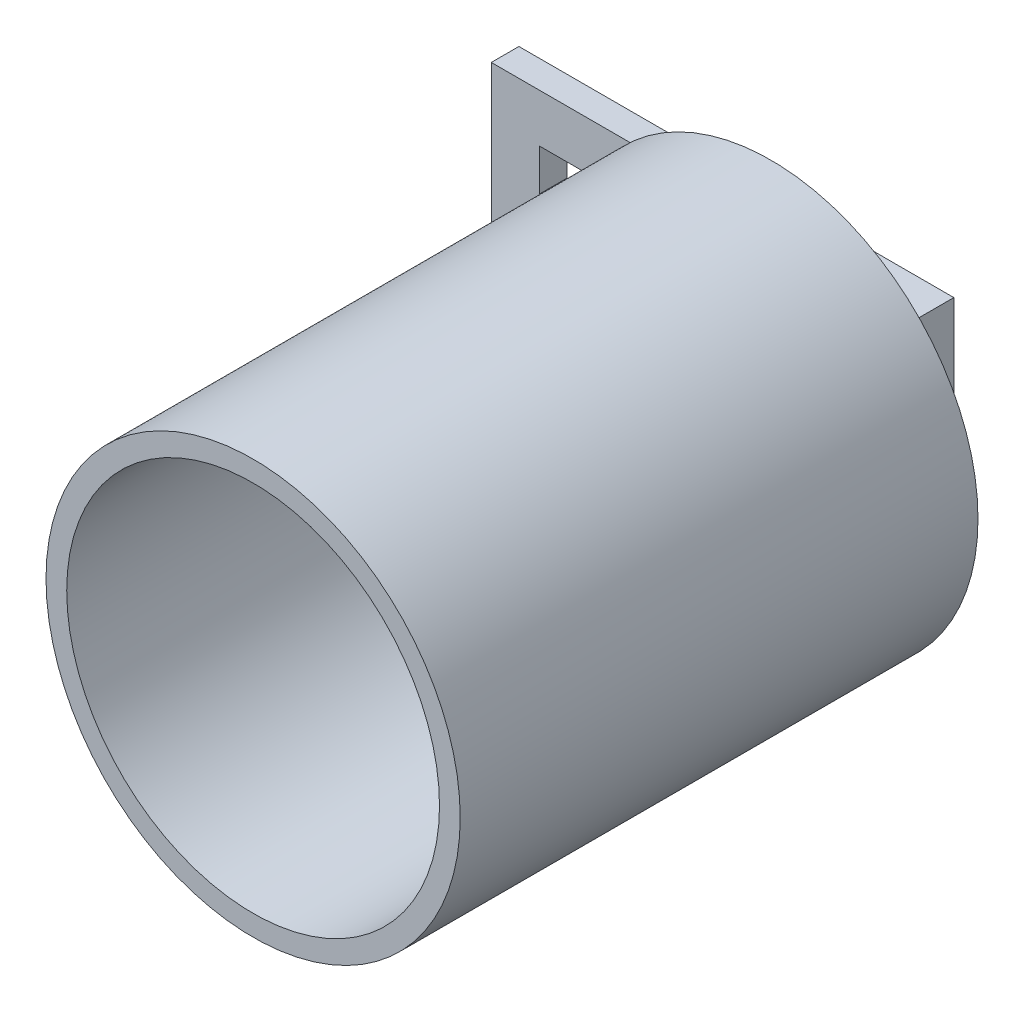
ISO-10303-21;
HEADER;
FILE_DESCRIPTION(('STEP AP214'),'2;1');
FILE_NAME('part.step','',(''),(''),'','','');
FILE_SCHEMA(('AUTOMOTIVE_DESIGN { 1 0 10303 214 1 1 1 1 }'));
ENDSEC;
DATA;
#1=APPLICATION_CONTEXT('core data for automotive mechanical design processes');
#2=APPLICATION_PROTOCOL_DEFINITION('international standard','automotive_design',2000,#1);
#3=PRODUCT_CONTEXT('',#1,'mechanical');
#4=PRODUCT('Part','Part','',(#3));
#5=PRODUCT_RELATED_PRODUCT_CATEGORY('part','',(#4));
#6=PRODUCT_DEFINITION_FORMATION('','',#4);
#7=PRODUCT_DEFINITION_CONTEXT('part definition',#1,'design');
#8=PRODUCT_DEFINITION('design','',#6,#7);
#9=PRODUCT_DEFINITION_SHAPE('','',#8);
#10=(LENGTH_UNIT() NAMED_UNIT(*) SI_UNIT(.MILLI.,.METRE.));
#11=(NAMED_UNIT(*) PLANE_ANGLE_UNIT() SI_UNIT($,.RADIAN.));
#12=(NAMED_UNIT(*) SI_UNIT($,.STERADIAN.) SOLID_ANGLE_UNIT());
#13=UNCERTAINTY_MEASURE_WITH_UNIT(LENGTH_MEASURE(1.E-05),#10,'distance_accuracy_value','');
#14=(GEOMETRIC_REPRESENTATION_CONTEXT(3) GLOBAL_UNCERTAINTY_ASSIGNED_CONTEXT((#13)) GLOBAL_UNIT_ASSIGNED_CONTEXT((#10,
#11,#12)) REPRESENTATION_CONTEXT('',''));
#15=CARTESIAN_POINT('',(0.,0.,0.));
#16=DIRECTION('',(0.,0.,1.));
#17=DIRECTION('',(1.,0.,0.));
#18=AXIS2_PLACEMENT_3D('',#15,#16,#17);
#19=CARTESIAN_POINT('',(-10.5,-10.,-16.));
#20=DIRECTION('',(1.,0.,0.));
#21=DIRECTION('',(0.,0.,-1.));
#22=AXIS2_PLACEMENT_3D('',#19,#20,#21);
#23=PLANE('',#22);
#24=DIRECTION('',(0.,1.,0.));
#25=VECTOR('',#24,1.);
#26=CARTESIAN_POINT('',(-10.5,10.,-12.));
#27=LINE('',#26,#25);
#28=CARTESIAN_POINT('',(-10.5,-10.,-12.));
#29=VERTEX_POINT('',#28);
#30=CARTESIAN_POINT('',(-10.5,10.,-12.));
#31=VERTEX_POINT('',#30);
#32=EDGE_CURVE('E126',#29,#31,#27,.T.);
#33=ORIENTED_EDGE('',*,*,#32,.F.);
#34=DIRECTION('',(0.,0.,1.));
#35=VECTOR('',#34,1.);
#36=CARTESIAN_POINT('',(-10.5,-10.,-16.));
#37=LINE('',#36,#35);
#38=CARTESIAN_POINT('',(-10.5,-10.,0.));
#39=VERTEX_POINT('',#38);
#40=EDGE_CURVE('E174',#29,#39,#37,.T.);
#41=ORIENTED_EDGE('',*,*,#40,.T.);
#42=DIRECTION('',(0.,1.,0.));
#43=VECTOR('',#42,1.);
#44=CARTESIAN_POINT('',(-10.5,-10.,0.));
#45=LINE('',#44,#43);
#46=CARTESIAN_POINT('',(-10.5,10.,0.));
#47=VERTEX_POINT('',#46);
#48=EDGE_CURVE('E166',#39,#47,#45,.T.);
#49=ORIENTED_EDGE('',*,*,#48,.T.);
#50=DIRECTION('',(0.,0.,1.));
#51=VECTOR('',#50,1.);
#52=CARTESIAN_POINT('',(-10.5,10.,-16.));
#53=LINE('',#52,#51);
#54=EDGE_CURVE('E192',#31,#47,#53,.T.);
#55=ORIENTED_EDGE('',*,*,#54,.F.);
#56=EDGE_LOOP('',(#33,#41,#49,#55));
#57=FACE_BOUND('',#56,.T.);
#58=ADVANCED_FACE('F35',(#57),#23,.F.);
#59=CARTESIAN_POINT('',(0.,0.,0.));
#60=DIRECTION('',(0.,0.,1.));
#61=DIRECTION('',(1.,0.,0.));
#62=AXIS2_PLACEMENT_3D('',#59,#60,#61);
#63=PLANE('',#62);
#64=CARTESIAN_POINT('',(0.,0.,0.));
#65=DIRECTION('',(0.,0.,1.));
#66=DIRECTION('',(1.,0.,0.));
#67=AXIS2_PLACEMENT_3D('',#64,#65,#66);
#68=CIRCLE('',#67,30.);
#69=CARTESIAN_POINT('',(30.,0.,0.));
#70=VERTEX_POINT('',#69);
#71=EDGE_CURVE('E39',#70,#70,#68,.T.);
#72=ORIENTED_EDGE('',*,*,#71,.F.);
#73=EDGE_LOOP('',(#72));
#74=FACE_BOUND('',#73,.T.);
#75=ORIENTED_EDGE('',*,*,#48,.F.);
#76=DIRECTION('',(-1.,0.,0.));
#77=VECTOR('',#76,1.);
#78=CARTESIAN_POINT('',(10.5,-10.,0.));
#79=LINE('',#78,#77);
#80=CARTESIAN_POINT('',(10.5,-10.,0.));
#81=VERTEX_POINT('',#80);
#82=EDGE_CURVE('E170',#81,#39,#79,.T.);
#83=ORIENTED_EDGE('',*,*,#82,.F.);
#84=DIRECTION('',(0.,-1.,0.));
#85=VECTOR('',#84,1.);
#86=CARTESIAN_POINT('',(10.5,-10.,0.));
#87=LINE('',#86,#85);
#88=CARTESIAN_POINT('',(10.5,10.,0.));
#89=VERTEX_POINT('',#88);
#90=EDGE_CURVE('E180',#89,#81,#87,.T.);
#91=ORIENTED_EDGE('',*,*,#90,.F.);
#92=DIRECTION('',(1.,0.,0.));
#93=VECTOR('',#92,1.);
#94=CARTESIAN_POINT('',(10.5,10.,0.));
#95=LINE('',#94,#93);
#96=EDGE_CURVE('E177',#47,#89,#95,.T.);
#97=ORIENTED_EDGE('',*,*,#96,.F.);
#98=EDGE_LOOP('',(#75,#83,#91,#97));
#99=FACE_BOUND('',#98,.T.);
#100=ADVANCED_FACE('F211',(#74,#99),#63,.F.);
#101=CARTESIAN_POINT('',(0.,0.,75.));
#102=DIRECTION('',(0.,0.,-1.));
#103=DIRECTION('',(-1.,0.,0.));
#104=AXIS2_PLACEMENT_3D('',#101,#102,#103);
#105=CYLINDRICAL_SURFACE('',#104,30.);
#106=CARTESIAN_POINT('',(0.,0.,75.));
#107=DIRECTION('',(0.,0.,1.));
#108=DIRECTION('',(1.,0.,0.));
#109=AXIS2_PLACEMENT_3D('',#106,#107,#108);
#110=CIRCLE('',#109,30.);
#111=CARTESIAN_POINT('',(30.,0.,75.));
#112=VERTEX_POINT('',#111);
#113=EDGE_CURVE('E11',#112,#112,#110,.T.);
#114=ORIENTED_EDGE('',*,*,#113,.F.);
#115=EDGE_LOOP('',(#114));
#116=FACE_BOUND('',#115,.T.);
#117=ORIENTED_EDGE('',*,*,#71,.T.);
#118=EDGE_LOOP('',(#117));
#119=FACE_BOUND('',#118,.T.);
#120=ADVANCED_FACE('F37',(#116,#119),#105,.T.);
#121=CARTESIAN_POINT('',(0.,0.,75.));
#122=DIRECTION('',(0.,0.,1.));
#123=DIRECTION('',(1.,0.,0.));
#124=AXIS2_PLACEMENT_3D('',#121,#122,#123);
#125=PLANE('',#124);
#126=CARTESIAN_POINT('',(0.,0.,75.));
#127=DIRECTION('',(0.,0.,1.));
#128=DIRECTION('',(1.,0.,0.));
#129=AXIS2_PLACEMENT_3D('',#126,#127,#128);
#130=CIRCLE('',#129,27.);
#131=CARTESIAN_POINT('',(27.,0.,75.));
#132=VERTEX_POINT('',#131);
#133=EDGE_CURVE('E194',#132,#132,#130,.T.);
#134=ORIENTED_EDGE('',*,*,#133,.F.);
#135=EDGE_LOOP('',(#134));
#136=FACE_BOUND('',#135,.T.);
#137=ORIENTED_EDGE('',*,*,#113,.T.);
#138=EDGE_LOOP('',(#137));
#139=FACE_BOUND('',#138,.T.);
#140=ADVANCED_FACE('F203',(#136,#139),#125,.T.);
#141=CARTESIAN_POINT('',(0.,0.,4.99999999999999));
#142=DIRECTION('',(0.,0.,1.));
#143=DIRECTION('',(1.,0.,0.));
#144=AXIS2_PLACEMENT_3D('',#141,#142,#143);
#145=CYLINDRICAL_SURFACE('',#144,27.);
#146=CARTESIAN_POINT('',(0.,0.,4.99999999999999));
#147=DIRECTION('',(0.,0.,1.));
#148=DIRECTION('',(1.,0.,0.));
#149=AXIS2_PLACEMENT_3D('',#146,#147,#148);
#150=CIRCLE('',#149,27.);
#151=CARTESIAN_POINT('',(27.,0.,4.99999999999999));
#152=VERTEX_POINT('',#151);
#153=EDGE_CURVE('E195',#152,#152,#150,.T.);
#154=ORIENTED_EDGE('',*,*,#153,.F.);
#155=EDGE_LOOP('',(#154));
#156=FACE_BOUND('',#155,.T.);
#157=ORIENTED_EDGE('',*,*,#133,.T.);
#158=EDGE_LOOP('',(#157));
#159=FACE_BOUND('',#158,.T.);
#160=ADVANCED_FACE('F201',(#156,#159),#145,.F.);
#161=CARTESIAN_POINT('',(0.,0.,4.99999999999999));
#162=DIRECTION('',(0.,0.,1.));
#163=DIRECTION('',(1.,0.,0.));
#164=AXIS2_PLACEMENT_3D('',#161,#162,#163);
#165=PLANE('',#164);
#166=ORIENTED_EDGE('',*,*,#153,.T.);
#167=EDGE_LOOP('',(#166));
#168=FACE_BOUND('',#167,.T.);
#169=ADVANCED_FACE('F258',(#168),#165,.T.);
#170=CARTESIAN_POINT('',(10.5,10.,-16.));
#171=DIRECTION('',(0.,-1.,0.));
#172=DIRECTION('',(0.,0.,-1.));
#173=AXIS2_PLACEMENT_3D('',#170,#171,#172);
#174=PLANE('',#173);
#175=ORIENTED_EDGE('',*,*,#96,.T.);
#176=DIRECTION('',(0.,0.,1.));
#177=VECTOR('',#176,1.);
#178=CARTESIAN_POINT('',(10.5,10.,-16.));
#179=LINE('',#178,#177);
#180=CARTESIAN_POINT('',(10.5,10.,-16.));
#181=VERTEX_POINT('',#180);
#182=EDGE_CURVE('E189',#181,#89,#179,.T.);
#183=ORIENTED_EDGE('',*,*,#182,.F.);
#184=DIRECTION('',(1.,0.,0.));
#185=VECTOR('',#184,1.);
#186=CARTESIAN_POINT('',(10.5,10.,-16.));
#187=LINE('',#186,#185);
#188=CARTESIAN_POINT('',(-52.5,10.,-16.));
#189=VERTEX_POINT('',#188);
#190=EDGE_CURVE('E167',#189,#181,#187,.T.);
#191=ORIENTED_EDGE('',*,*,#190,.F.);
#192=DIRECTION('',(0.,0.,-1.));
#193=VECTOR('',#192,1.);
#194=CARTESIAN_POINT('',(-52.5,10.,-16.));
#195=LINE('',#194,#193);
#196=CARTESIAN_POINT('',(-52.5,10.,-12.));
#197=VERTEX_POINT('',#196);
#198=EDGE_CURVE('E152',#197,#189,#195,.T.);
#199=ORIENTED_EDGE('',*,*,#198,.F.);
#200=DIRECTION('',(1.,0.,0.));
#201=VECTOR('',#200,1.);
#202=CARTESIAN_POINT('',(-52.5,10.,-12.));
#203=LINE('',#202,#201);
#204=EDGE_CURVE('E164',#197,#31,#203,.T.);
#205=ORIENTED_EDGE('',*,*,#204,.T.);
#206=ORIENTED_EDGE('',*,*,#54,.T.);
#207=EDGE_LOOP('',(#175,#183,#191,#199,#205,#206));
#208=FACE_BOUND('',#207,.T.);
#209=ADVANCED_FACE('F233',(#208),#174,.F.);
#210=CARTESIAN_POINT('',(10.5,-10.,-16.));
#211=DIRECTION('',(-1.,0.,0.));
#212=DIRECTION('',(0.,0.,1.));
#213=AXIS2_PLACEMENT_3D('',#210,#211,#212);
#214=PLANE('',#213);
#215=ORIENTED_EDGE('',*,*,#90,.T.);
#216=DIRECTION('',(0.,0.,1.));
#217=VECTOR('',#216,1.);
#218=CARTESIAN_POINT('',(10.5,-10.,-16.));
#219=LINE('',#218,#217);
#220=CARTESIAN_POINT('',(10.5,-10.,-16.));
#221=VERTEX_POINT('',#220);
#222=EDGE_CURVE('E186',#221,#81,#219,.T.);
#223=ORIENTED_EDGE('',*,*,#222,.F.);
#224=DIRECTION('',(0.,-1.,0.));
#225=VECTOR('',#224,1.);
#226=CARTESIAN_POINT('',(10.5,-10.,-16.));
#227=LINE('',#226,#225);
#228=EDGE_CURVE('E169',#181,#221,#227,.T.);
#229=ORIENTED_EDGE('',*,*,#228,.F.);
#230=ORIENTED_EDGE('',*,*,#182,.T.);
#231=EDGE_LOOP('',(#215,#223,#229,#230));
#232=FACE_BOUND('',#231,.T.);
#233=ADVANCED_FACE('F230',(#232),#214,.F.);
#234=CARTESIAN_POINT('',(10.5,-10.,-16.));
#235=DIRECTION('',(0.,1.,0.));
#236=DIRECTION('',(0.,0.,1.));
#237=AXIS2_PLACEMENT_3D('',#234,#235,#236);
#238=PLANE('',#237);
#239=ORIENTED_EDGE('',*,*,#82,.T.);
#240=ORIENTED_EDGE('',*,*,#40,.F.);
#241=DIRECTION('',(1.,0.,0.));
#242=VECTOR('',#241,1.);
#243=CARTESIAN_POINT('',(-52.5,-10.,-12.));
#244=LINE('',#243,#242);
#245=CARTESIAN_POINT('',(-52.5,-10.,-12.));
#246=VERTEX_POINT('',#245);
#247=EDGE_CURVE('E160',#246,#29,#244,.T.);
#248=ORIENTED_EDGE('',*,*,#247,.F.);
#249=DIRECTION('',(0.,0.,1.));
#250=VECTOR('',#249,1.);
#251=CARTESIAN_POINT('',(-52.5,-10.,-16.));
#252=LINE('',#251,#250);
#253=CARTESIAN_POINT('',(-52.5,-10.,-16.));
#254=VERTEX_POINT('',#253);
#255=EDGE_CURVE('E158',#254,#246,#252,.T.);
#256=ORIENTED_EDGE('',*,*,#255,.F.);
#257=DIRECTION('',(-1.,0.,0.));
#258=VECTOR('',#257,1.);
#259=CARTESIAN_POINT('',(10.5,-10.,-16.));
#260=LINE('',#259,#258);
#261=EDGE_CURVE('E172',#221,#254,#260,.T.);
#262=ORIENTED_EDGE('',*,*,#261,.F.);
#263=ORIENTED_EDGE('',*,*,#222,.T.);
#264=EDGE_LOOP('',(#239,#240,#248,#256,#262,#263));
#265=FACE_BOUND('',#264,.T.);
#266=ADVANCED_FACE('F223',(#265),#238,.F.);
#267=CARTESIAN_POINT('',(0.,0.,-16.));
#268=DIRECTION('',(0.,0.,1.));
#269=DIRECTION('',(1.,0.,0.));
#270=AXIS2_PLACEMENT_3D('',#267,#268,#269);
#271=PLANE('',#270);
#272=DIRECTION('',(1.,0.,0.));
#273=VECTOR('',#272,1.);
#274=CARTESIAN_POINT('',(-35.5,3.,-16.));
#275=LINE('',#274,#273);
#276=CARTESIAN_POINT('',(-45.5,3.,-16.));
#277=VERTEX_POINT('',#276);
#278=CARTESIAN_POINT('',(-35.5,3.,-16.));
#279=VERTEX_POINT('',#278);
#280=EDGE_CURVE('E134',#277,#279,#275,.T.);
#281=ORIENTED_EDGE('',*,*,#280,.F.);
#282=DIRECTION('',(0.,1.,0.));
#283=VECTOR('',#282,1.);
#284=CARTESIAN_POINT('',(-45.5,-3.,-16.));
#285=LINE('',#284,#283);
#286=CARTESIAN_POINT('',(-45.5,-3.,-16.));
#287=VERTEX_POINT('',#286);
#288=EDGE_CURVE('E50',#287,#277,#285,.T.);
#289=ORIENTED_EDGE('',*,*,#288,.F.);
#290=DIRECTION('',(-1.,0.,0.));
#291=VECTOR('',#290,1.);
#292=CARTESIAN_POINT('',(-35.5,-3.,-16.));
#293=LINE('',#292,#291);
#294=CARTESIAN_POINT('',(-35.5,-3.,-16.));
#295=VERTEX_POINT('',#294);
#296=EDGE_CURVE('E120',#295,#287,#293,.T.);
#297=ORIENTED_EDGE('',*,*,#296,.F.);
#298=DIRECTION('',(0.,-1.,0.));
#299=VECTOR('',#298,1.);
#300=CARTESIAN_POINT('',(-35.5,-3.,-16.));
#301=LINE('',#300,#299);
#302=EDGE_CURVE('E140',#279,#295,#301,.T.);
#303=ORIENTED_EDGE('',*,*,#302,.F.);
#304=EDGE_LOOP('',(#281,#289,#297,#303));
#305=FACE_BOUND('',#304,.T.);
#306=ORIENTED_EDGE('',*,*,#261,.T.);
#307=DIRECTION('',(0.,-1.,0.));
#308=VECTOR('',#307,1.);
#309=CARTESIAN_POINT('',(-52.5,10.,-16.));
#310=LINE('',#309,#308);
#311=EDGE_CURVE('E155',#189,#254,#310,.T.);
#312=ORIENTED_EDGE('',*,*,#311,.F.);
#313=ORIENTED_EDGE('',*,*,#190,.T.);
#314=ORIENTED_EDGE('',*,*,#228,.T.);
#315=EDGE_LOOP('',(#306,#312,#313,#314));
#316=FACE_BOUND('',#315,.T.);
#317=ADVANCED_FACE('F241',(#305,#316),#271,.F.);
#318=CARTESIAN_POINT('',(-52.5,10.,-12.));
#319=DIRECTION('',(0.,0.,-1.));
#320=DIRECTION('',(0.,1.,0.));
#321=AXIS2_PLACEMENT_3D('',#318,#319,#320);
#322=PLANE('',#321);
#323=DIRECTION('',(1.,0.,0.));
#324=VECTOR('',#323,1.);
#325=CARTESIAN_POINT('',(-35.5,-3.,-12.));
#326=LINE('',#325,#324);
#327=CARTESIAN_POINT('',(-45.5,-3.,-12.));
#328=VERTEX_POINT('',#327);
#329=CARTESIAN_POINT('',(-35.5,-3.,-12.));
#330=VERTEX_POINT('',#329);
#331=EDGE_CURVE('E132',#328,#330,#326,.T.);
#332=ORIENTED_EDGE('',*,*,#331,.F.);
#333=DIRECTION('',(0.,-1.,0.));
#334=VECTOR('',#333,1.);
#335=CARTESIAN_POINT('',(-45.5,-3.00000000000001,-12.));
#336=LINE('',#335,#334);
#337=CARTESIAN_POINT('',(-45.5,3.,-12.));
#338=VERTEX_POINT('',#337);
#339=EDGE_CURVE('E114',#338,#328,#336,.T.);
#340=ORIENTED_EDGE('',*,*,#339,.F.);
#341=DIRECTION('',(-1.,0.,0.));
#342=VECTOR('',#341,1.);
#343=CARTESIAN_POINT('',(-35.5,3.,-12.));
#344=LINE('',#343,#342);
#345=CARTESIAN_POINT('',(-35.5,3.,-12.));
#346=VERTEX_POINT('',#345);
#347=EDGE_CURVE('E123',#346,#338,#344,.T.);
#348=ORIENTED_EDGE('',*,*,#347,.F.);
#349=DIRECTION('',(0.,1.,0.));
#350=VECTOR('',#349,1.);
#351=CARTESIAN_POINT('',(-35.5,-3.00000000000001,-12.));
#352=LINE('',#351,#350);
#353=EDGE_CURVE('E58',#330,#346,#352,.T.);
#354=ORIENTED_EDGE('',*,*,#353,.F.);
#355=EDGE_LOOP('',(#332,#340,#348,#354));
#356=FACE_BOUND('',#355,.T.);
#357=ORIENTED_EDGE('',*,*,#32,.T.);
#358=ORIENTED_EDGE('',*,*,#204,.F.);
#359=DIRECTION('',(0.,1.,0.));
#360=VECTOR('',#359,1.);
#361=CARTESIAN_POINT('',(-52.5,10.,-12.));
#362=LINE('',#361,#360);
#363=EDGE_CURVE('E149',#246,#197,#362,.T.);
#364=ORIENTED_EDGE('',*,*,#363,.F.);
#365=ORIENTED_EDGE('',*,*,#247,.T.);
#366=EDGE_LOOP('',(#357,#358,#364,#365));
#367=FACE_BOUND('',#366,.T.);
#368=ADVANCED_FACE('F129',(#356,#367),#322,.F.);
#369=CARTESIAN_POINT('',(-52.5,0.,0.));
#370=DIRECTION('',(-1.,0.,0.));
#371=DIRECTION('',(0.,0.,1.));
#372=AXIS2_PLACEMENT_3D('',#369,#370,#371);
#373=PLANE('',#372);
#374=ORIENTED_EDGE('',*,*,#363,.T.);
#375=ORIENTED_EDGE('',*,*,#198,.T.);
#376=ORIENTED_EDGE('',*,*,#311,.T.);
#377=ORIENTED_EDGE('',*,*,#255,.T.);
#378=EDGE_LOOP('',(#374,#375,#376,#377));
#379=FACE_BOUND('',#378,.T.);
#380=ADVANCED_FACE('F238',(#379),#373,.T.);
#381=CARTESIAN_POINT('',(-45.5,-3.,75.001));
#382=DIRECTION('',(-1.,0.,0.));
#383=DIRECTION('',(0.,0.,1.));
#384=AXIS2_PLACEMENT_3D('',#381,#382,#383);
#385=PLANE('',#384);
#386=ORIENTED_EDGE('',*,*,#339,.T.);
#387=DIRECTION('',(0.,0.,-1.));
#388=VECTOR('',#387,1.);
#389=CARTESIAN_POINT('',(-45.5,-3.,75.001));
#390=LINE('',#389,#388);
#391=EDGE_CURVE('E127',#328,#287,#390,.T.);
#392=ORIENTED_EDGE('',*,*,#391,.T.);
#393=ORIENTED_EDGE('',*,*,#288,.T.);
#394=DIRECTION('',(0.,0.,-1.));
#395=VECTOR('',#394,1.);
#396=CARTESIAN_POINT('',(-45.5,3.,75.001));
#397=LINE('',#396,#395);
#398=EDGE_CURVE('E110',#338,#277,#397,.T.);
#399=ORIENTED_EDGE('',*,*,#398,.F.);
#400=EDGE_LOOP('',(#386,#392,#393,#399));
#401=FACE_BOUND('',#400,.T.);
#402=ADVANCED_FACE('F112',(#401),#385,.F.);
#403=CARTESIAN_POINT('',(-35.5,-3.,75.001));
#404=DIRECTION('',(0.,-1.,0.));
#405=DIRECTION('',(0.,0.,-1.));
#406=AXIS2_PLACEMENT_3D('',#403,#404,#405);
#407=PLANE('',#406);
#408=ORIENTED_EDGE('',*,*,#331,.T.);
#409=DIRECTION('',(0.,0.,-1.));
#410=VECTOR('',#409,1.);
#411=CARTESIAN_POINT('',(-35.5,-3.,75.001));
#412=LINE('',#411,#410);
#413=EDGE_CURVE('E146',#330,#295,#412,.T.);
#414=ORIENTED_EDGE('',*,*,#413,.T.);
#415=ORIENTED_EDGE('',*,*,#296,.T.);
#416=ORIENTED_EDGE('',*,*,#391,.F.);
#417=EDGE_LOOP('',(#408,#414,#415,#416));
#418=FACE_BOUND('',#417,.T.);
#419=ADVANCED_FACE('F317',(#418),#407,.F.);
#420=CARTESIAN_POINT('',(-35.5,-3.,75.001));
#421=DIRECTION('',(1.,0.,0.));
#422=DIRECTION('',(0.,0.,-1.));
#423=AXIS2_PLACEMENT_3D('',#420,#421,#422);
#424=PLANE('',#423);
#425=ORIENTED_EDGE('',*,*,#353,.T.);
#426=DIRECTION('',(0.,0.,-1.));
#427=VECTOR('',#426,1.);
#428=CARTESIAN_POINT('',(-35.5,3.,75.001));
#429=LINE('',#428,#427);
#430=EDGE_CURVE('E119',#346,#279,#429,.T.);
#431=ORIENTED_EDGE('',*,*,#430,.T.);
#432=ORIENTED_EDGE('',*,*,#302,.T.);
#433=ORIENTED_EDGE('',*,*,#413,.F.);
#434=EDGE_LOOP('',(#425,#431,#432,#433));
#435=FACE_BOUND('',#434,.T.);
#436=ADVANCED_FACE('F326',(#435),#424,.F.);
#437=CARTESIAN_POINT('',(-35.5,3.,75.001));
#438=DIRECTION('',(0.,1.,0.));
#439=DIRECTION('',(0.,0.,1.));
#440=AXIS2_PLACEMENT_3D('',#437,#438,#439);
#441=PLANE('',#440);
#442=ORIENTED_EDGE('',*,*,#347,.T.);
#443=ORIENTED_EDGE('',*,*,#398,.T.);
#444=ORIENTED_EDGE('',*,*,#280,.T.);
#445=ORIENTED_EDGE('',*,*,#430,.F.);
#446=EDGE_LOOP('',(#442,#443,#444,#445));
#447=FACE_BOUND('',#446,.T.);
#448=ADVANCED_FACE('F124',(#447),#441,.F.);
#449=CLOSED_SHELL('',(#58,#100,#120,#140,#160,#169,#209,#233,#266,#317,#368,#380,#402,#419,#436,#448));
#450=MANIFOLD_SOLID_BREP('B2',#449);
#451=ADVANCED_BREP_SHAPE_REPRESENTATION('',(#18,#450),#14);
#452=SHAPE_DEFINITION_REPRESENTATION(#9,#451);
ENDSEC;
END-ISO-10303-21;
